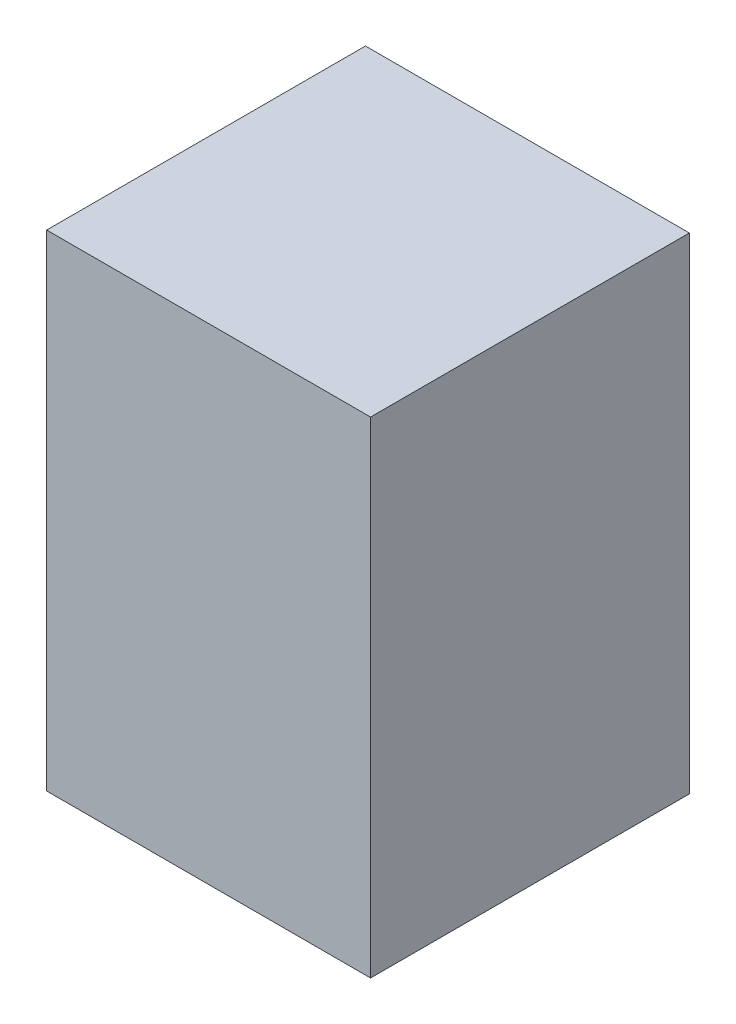
ISO-10303-21;
HEADER;
FILE_DESCRIPTION(('STEP AP214'),'2;1');
FILE_NAME('part.step','',(''),(''),'','','');
FILE_SCHEMA(('AUTOMOTIVE_DESIGN { 1 0 10303 214 1 1 1 1 }'));
ENDSEC;
DATA;
#1=APPLICATION_CONTEXT('core data for automotive mechanical design processes');
#2=APPLICATION_PROTOCOL_DEFINITION('international standard','automotive_design',2000,#1);
#3=PRODUCT_CONTEXT('',#1,'mechanical');
#4=PRODUCT('Part','Part','',(#3));
#5=PRODUCT_RELATED_PRODUCT_CATEGORY('part','',(#4));
#6=PRODUCT_DEFINITION_FORMATION('','',#4);
#7=PRODUCT_DEFINITION_CONTEXT('part definition',#1,'design');
#8=PRODUCT_DEFINITION('design','',#6,#7);
#9=PRODUCT_DEFINITION_SHAPE('','',#8);
#10=(LENGTH_UNIT() NAMED_UNIT(*) SI_UNIT(.MILLI.,.METRE.));
#11=(NAMED_UNIT(*) PLANE_ANGLE_UNIT() SI_UNIT($,.RADIAN.));
#12=(NAMED_UNIT(*) SI_UNIT($,.STERADIAN.) SOLID_ANGLE_UNIT());
#13=UNCERTAINTY_MEASURE_WITH_UNIT(LENGTH_MEASURE(1.E-05),#10,'distance_accuracy_value','');
#14=(GEOMETRIC_REPRESENTATION_CONTEXT(3) GLOBAL_UNCERTAINTY_ASSIGNED_CONTEXT((#13)) GLOBAL_UNIT_ASSIGNED_CONTEXT((#10,
#11,#12)) REPRESENTATION_CONTEXT('',''));
#15=CARTESIAN_POINT('',(0.,0.,0.));
#16=DIRECTION('',(0.,0.,1.));
#17=DIRECTION('',(1.,0.,0.));
#18=AXIS2_PLACEMENT_3D('',#15,#16,#17);
#19=CARTESIAN_POINT('',(0.508,0.762,1.));
#20=DIRECTION('',(0.,0.,-1.));
#21=DIRECTION('',(-1.,0.,0.));
#22=AXIS2_PLACEMENT_3D('',#19,#20,#21);
#23=PLANE('',#22);
#24=DIRECTION('',(0.,1.,0.));
#25=VECTOR('',#24,1.);
#26=CARTESIAN_POINT('',(-0.508,0.762,1.));
#27=LINE('',#26,#25);
#28=CARTESIAN_POINT('',(-0.508,0.762,1.));
#29=VERTEX_POINT('',#28);
#30=CARTESIAN_POINT('',(-0.508,-0.762,1.));
#31=VERTEX_POINT('',#30);
#32=EDGE_CURVE('E55',#29,#31,#27,.F.);
#33=ORIENTED_EDGE('',*,*,#32,.T.);
#34=DIRECTION('',(1.,0.,0.));
#35=VECTOR('',#34,1.);
#36=CARTESIAN_POINT('',(-0.508,-0.762,1.));
#37=LINE('',#36,#35);
#38=CARTESIAN_POINT('',(0.508,-0.762,1.));
#39=VERTEX_POINT('',#38);
#40=EDGE_CURVE('E57',#31,#39,#37,.T.);
#41=ORIENTED_EDGE('',*,*,#40,.T.);
#42=DIRECTION('',(0.,1.,0.));
#43=VECTOR('',#42,1.);
#44=CARTESIAN_POINT('',(0.508,-0.762,1.));
#45=LINE('',#44,#43);
#46=CARTESIAN_POINT('',(0.508,0.762,1.));
#47=VERTEX_POINT('',#46);
#48=EDGE_CURVE('E20',#39,#47,#45,.T.);
#49=ORIENTED_EDGE('',*,*,#48,.T.);
#50=DIRECTION('',(1.,0.,0.));
#51=VECTOR('',#50,1.);
#52=CARTESIAN_POINT('',(0.508,0.762,1.));
#53=LINE('',#52,#51);
#54=EDGE_CURVE('E80',#47,#29,#53,.F.);
#55=ORIENTED_EDGE('',*,*,#54,.T.);
#56=EDGE_LOOP('',(#33,#41,#49,#55));
#57=FACE_BOUND('',#56,.T.);
#58=ADVANCED_FACE('F17',(#57),#23,.F.);
#59=CARTESIAN_POINT('',(0.508,-0.762,0.));
#60=DIRECTION('',(-1.,0.,0.));
#61=DIRECTION('',(0.,0.,1.));
#62=AXIS2_PLACEMENT_3D('',#59,#60,#61);
#63=PLANE('',#62);
#64=DIRECTION('',(0.,0.,-1.));
#65=VECTOR('',#64,1.);
#66=CARTESIAN_POINT('',(0.508,0.762,0.));
#67=LINE('',#66,#65);
#68=CARTESIAN_POINT('',(0.508,0.762,0.));
#69=VERTEX_POINT('',#68);
#70=EDGE_CURVE('E68',#69,#47,#67,.F.);
#71=ORIENTED_EDGE('',*,*,#70,.T.);
#72=ORIENTED_EDGE('',*,*,#48,.F.);
#73=DIRECTION('',(0.,0.,1.));
#74=VECTOR('',#73,1.);
#75=CARTESIAN_POINT('',(0.508,-0.762,0.));
#76=LINE('',#75,#74);
#77=CARTESIAN_POINT('',(0.508,-0.762,0.));
#78=VERTEX_POINT('',#77);
#79=EDGE_CURVE('E63',#39,#78,#76,.F.);
#80=ORIENTED_EDGE('',*,*,#79,.T.);
#81=DIRECTION('',(0.,1.,0.));
#82=VECTOR('',#81,1.);
#83=CARTESIAN_POINT('',(0.508,0.762,0.));
#84=LINE('',#83,#82);
#85=EDGE_CURVE('E83',#69,#78,#84,.F.);
#86=ORIENTED_EDGE('',*,*,#85,.F.);
#87=EDGE_LOOP('',(#71,#72,#80,#86));
#88=FACE_BOUND('',#87,.T.);
#89=ADVANCED_FACE('F65',(#88),#63,.F.);
#90=CARTESIAN_POINT('',(-0.508,-0.762,0.));
#91=DIRECTION('',(0.,1.,0.));
#92=DIRECTION('',(0.,0.,1.));
#93=AXIS2_PLACEMENT_3D('',#90,#91,#92);
#94=PLANE('',#93);
#95=ORIENTED_EDGE('',*,*,#79,.F.);
#96=ORIENTED_EDGE('',*,*,#40,.F.);
#97=DIRECTION('',(0.,0.,-1.));
#98=VECTOR('',#97,1.);
#99=CARTESIAN_POINT('',(-0.508,-0.762,0.));
#100=LINE('',#99,#98);
#101=CARTESIAN_POINT('',(-0.508,-0.762,0.));
#102=VERTEX_POINT('',#101);
#103=EDGE_CURVE('E75',#31,#102,#100,.T.);
#104=ORIENTED_EDGE('',*,*,#103,.T.);
#105=DIRECTION('',(-1.,0.,0.));
#106=VECTOR('',#105,1.);
#107=CARTESIAN_POINT('',(0.508,-0.762,0.));
#108=LINE('',#107,#106);
#109=EDGE_CURVE('E72',#78,#102,#108,.T.);
#110=ORIENTED_EDGE('',*,*,#109,.F.);
#111=EDGE_LOOP('',(#95,#96,#104,#110));
#112=FACE_BOUND('',#111,.T.);
#113=ADVANCED_FACE('F70',(#112),#94,.F.);
#114=CARTESIAN_POINT('',(-0.508,0.762,0.));
#115=DIRECTION('',(1.,0.,0.));
#116=DIRECTION('',(0.,0.,-1.));
#117=AXIS2_PLACEMENT_3D('',#114,#115,#116);
#118=PLANE('',#117);
#119=ORIENTED_EDGE('',*,*,#103,.F.);
#120=ORIENTED_EDGE('',*,*,#32,.F.);
#121=DIRECTION('',(0.,0.,-1.));
#122=VECTOR('',#121,1.);
#123=CARTESIAN_POINT('',(-0.508,0.762,0.));
#124=LINE('',#123,#122);
#125=CARTESIAN_POINT('',(-0.508,0.762,0.));
#126=VERTEX_POINT('',#125);
#127=EDGE_CURVE('E35',#29,#126,#124,.T.);
#128=ORIENTED_EDGE('',*,*,#127,.T.);
#129=DIRECTION('',(0.,1.,0.));
#130=VECTOR('',#129,1.);
#131=CARTESIAN_POINT('',(-0.508,0.762,0.));
#132=LINE('',#131,#130);
#133=EDGE_CURVE('E26',#102,#126,#132,.T.);
#134=ORIENTED_EDGE('',*,*,#133,.F.);
#135=EDGE_LOOP('',(#119,#120,#128,#134));
#136=FACE_BOUND('',#135,.T.);
#137=ADVANCED_FACE('F89',(#136),#118,.F.);
#138=CARTESIAN_POINT('',(0.508,0.762,0.));
#139=DIRECTION('',(0.,-1.,0.));
#140=DIRECTION('',(0.,0.,-1.));
#141=AXIS2_PLACEMENT_3D('',#138,#139,#140);
#142=PLANE('',#141);
#143=ORIENTED_EDGE('',*,*,#127,.F.);
#144=ORIENTED_EDGE('',*,*,#54,.F.);
#145=ORIENTED_EDGE('',*,*,#70,.F.);
#146=DIRECTION('',(-1.,0.,0.));
#147=VECTOR('',#146,1.);
#148=CARTESIAN_POINT('',(0.508,0.762,0.));
#149=LINE('',#148,#147);
#150=EDGE_CURVE('E11',#126,#69,#149,.F.);
#151=ORIENTED_EDGE('',*,*,#150,.F.);
#152=EDGE_LOOP('',(#143,#144,#145,#151));
#153=FACE_BOUND('',#152,.T.);
#154=ADVANCED_FACE('F91',(#153),#142,.F.);
#155=CARTESIAN_POINT('',(0.508,0.762,0.));
#156=DIRECTION('',(0.,0.,-1.));
#157=DIRECTION('',(-1.,0.,0.));
#158=AXIS2_PLACEMENT_3D('',#155,#156,#157);
#159=PLANE('',#158);
#160=ORIENTED_EDGE('',*,*,#133,.T.);
#161=ORIENTED_EDGE('',*,*,#150,.T.);
#162=ORIENTED_EDGE('',*,*,#85,.T.);
#163=ORIENTED_EDGE('',*,*,#109,.T.);
#164=EDGE_LOOP('',(#160,#161,#162,#163));
#165=FACE_BOUND('',#164,.T.);
#166=ADVANCED_FACE('F88',(#165),#159,.T.);
#167=CLOSED_SHELL('',(#58,#89,#113,#137,#154,#166));
#168=MANIFOLD_SOLID_BREP('B1',#167);
#169=ADVANCED_BREP_SHAPE_REPRESENTATION('',(#18,#168),#14);
#170=SHAPE_DEFINITION_REPRESENTATION(#9,#169);
ENDSEC;
END-ISO-10303-21;
